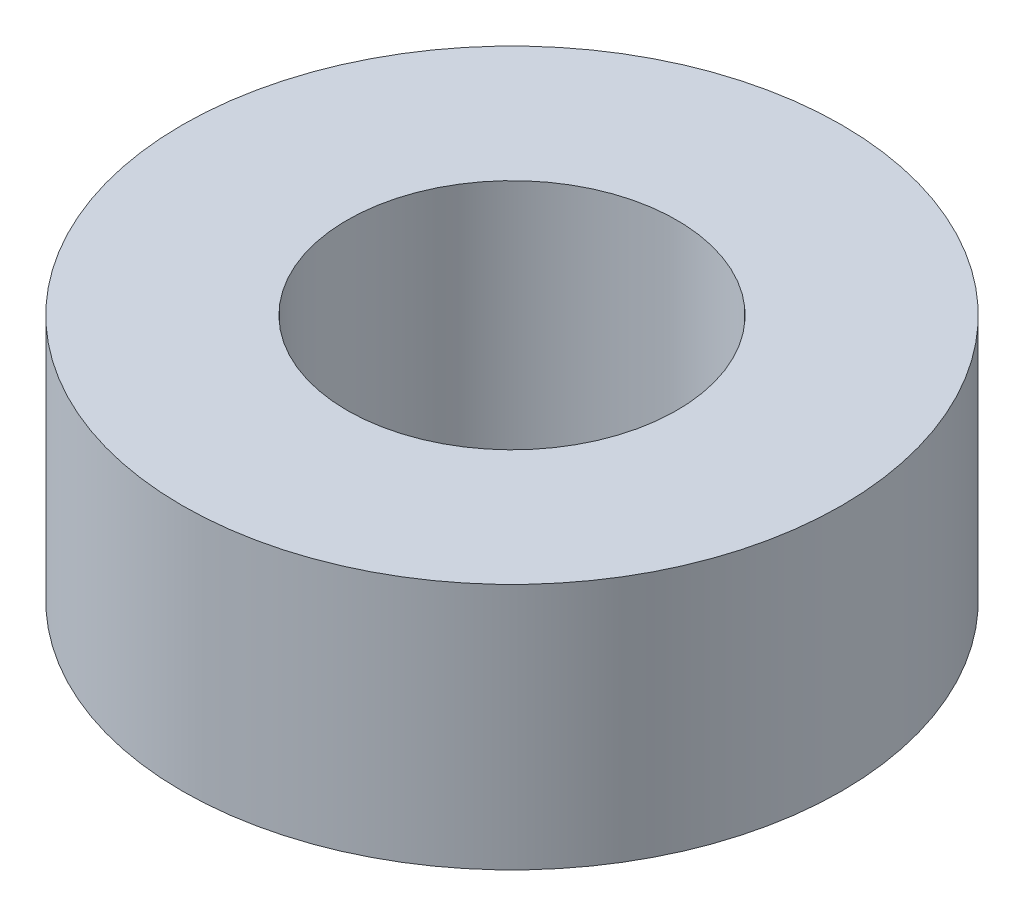
ISO-10303-21;
HEADER;
FILE_DESCRIPTION(('STEP AP214'),'2;1');
FILE_NAME('part.step','',(''),(''),'','','');
FILE_SCHEMA(('AUTOMOTIVE_DESIGN { 1 0 10303 214 1 1 1 1 }'));
ENDSEC;
DATA;
#1=APPLICATION_CONTEXT('core data for automotive mechanical design processes');
#2=APPLICATION_PROTOCOL_DEFINITION('international standard','automotive_design',2000,#1);
#3=PRODUCT_CONTEXT('',#1,'mechanical');
#4=PRODUCT('Part','Part','',(#3));
#5=PRODUCT_RELATED_PRODUCT_CATEGORY('part','',(#4));
#6=PRODUCT_DEFINITION_FORMATION('','',#4);
#7=PRODUCT_DEFINITION_CONTEXT('part definition',#1,'design');
#8=PRODUCT_DEFINITION('design','',#6,#7);
#9=PRODUCT_DEFINITION_SHAPE('','',#8);
#10=(LENGTH_UNIT() NAMED_UNIT(*) SI_UNIT(.MILLI.,.METRE.));
#11=(NAMED_UNIT(*) PLANE_ANGLE_UNIT() SI_UNIT($,.RADIAN.));
#12=(NAMED_UNIT(*) SI_UNIT($,.STERADIAN.) SOLID_ANGLE_UNIT());
#13=UNCERTAINTY_MEASURE_WITH_UNIT(LENGTH_MEASURE(1.E-05),#10,'distance_accuracy_value','');
#14=(GEOMETRIC_REPRESENTATION_CONTEXT(3) GLOBAL_UNCERTAINTY_ASSIGNED_CONTEXT((#13)) GLOBAL_UNIT_ASSIGNED_CONTEXT((#10,
#11,#12)) REPRESENTATION_CONTEXT('',''));
#15=CARTESIAN_POINT('',(0.,0.,0.));
#16=DIRECTION('',(0.,0.,1.));
#17=DIRECTION('',(1.,0.,0.));
#18=AXIS2_PLACEMENT_3D('',#15,#16,#17);
#19=CARTESIAN_POINT('',(0.,-1.5,0.));
#20=DIRECTION('',(0.,1.,0.));
#21=DIRECTION('',(0.,0.,1.));
#22=AXIS2_PLACEMENT_3D('',#19,#20,#21);
#23=CYLINDRICAL_SURFACE('',#22,4.);
#24=CARTESIAN_POINT('',(0.,-1.5,0.));
#25=DIRECTION('',(0.,1.,0.));
#26=DIRECTION('',(0.,0.,1.));
#27=AXIS2_PLACEMENT_3D('',#24,#25,#26);
#28=CIRCLE('',#27,4.);
#29=CARTESIAN_POINT('',(0.,-1.5,4.));
#30=VERTEX_POINT('',#29);
#31=EDGE_CURVE('E10',#30,#30,#28,.T.);
#32=ORIENTED_EDGE('',*,*,#31,.T.);
#33=EDGE_LOOP('',(#32));
#34=FACE_BOUND('',#33,.T.);
#35=CARTESIAN_POINT('',(0.,1.5,0.));
#36=DIRECTION('',(0.,1.,0.));
#37=DIRECTION('',(0.,0.,1.));
#38=AXIS2_PLACEMENT_3D('',#35,#36,#37);
#39=CIRCLE('',#38,4.);
#40=CARTESIAN_POINT('',(0.,1.5,4.));
#41=VERTEX_POINT('',#40);
#42=EDGE_CURVE('E48',#41,#41,#39,.T.);
#43=ORIENTED_EDGE('',*,*,#42,.F.);
#44=EDGE_LOOP('',(#43));
#45=FACE_BOUND('',#44,.T.);
#46=ADVANCED_FACE('F35',(#34,#45),#23,.T.);
#47=CARTESIAN_POINT('',(0.,-1.5,0.));
#48=DIRECTION('',(0.,1.,0.));
#49=DIRECTION('',(0.,0.,1.));
#50=AXIS2_PLACEMENT_3D('',#47,#48,#49);
#51=PLANE('',#50);
#52=CARTESIAN_POINT('',(0.,-1.5,0.));
#53=DIRECTION('',(0.,1.,0.));
#54=DIRECTION('',(0.,0.,1.));
#55=AXIS2_PLACEMENT_3D('',#52,#53,#54);
#56=CIRCLE('',#55,2.);
#57=CARTESIAN_POINT('',(0.,-1.5,2.));
#58=VERTEX_POINT('',#57);
#59=EDGE_CURVE('E42',#58,#58,#56,.T.);
#60=ORIENTED_EDGE('',*,*,#59,.T.);
#61=EDGE_LOOP('',(#60));
#62=FACE_BOUND('',#61,.T.);
#63=ORIENTED_EDGE('',*,*,#31,.F.);
#64=EDGE_LOOP('',(#63));
#65=FACE_BOUND('',#64,.T.);
#66=ADVANCED_FACE('F68',(#62,#65),#51,.F.);
#67=CARTESIAN_POINT('',(0.,-1.5,0.));
#68=DIRECTION('',(0.,1.,0.));
#69=DIRECTION('',(0.,0.,1.));
#70=AXIS2_PLACEMENT_3D('',#67,#68,#69);
#71=CYLINDRICAL_SURFACE('',#70,2.);
#72=ORIENTED_EDGE('',*,*,#59,.F.);
#73=EDGE_LOOP('',(#72));
#74=FACE_BOUND('',#73,.T.);
#75=CARTESIAN_POINT('',(0.,1.5,0.));
#76=DIRECTION('',(0.,1.,0.));
#77=DIRECTION('',(0.,0.,1.));
#78=AXIS2_PLACEMENT_3D('',#75,#76,#77);
#79=CIRCLE('',#78,2.);
#80=CARTESIAN_POINT('',(0.,1.5,2.));
#81=VERTEX_POINT('',#80);
#82=EDGE_CURVE('E53',#81,#81,#79,.T.);
#83=ORIENTED_EDGE('',*,*,#82,.T.);
#84=EDGE_LOOP('',(#83));
#85=FACE_BOUND('',#84,.T.);
#86=ADVANCED_FACE('F59',(#74,#85),#71,.F.);
#87=CARTESIAN_POINT('',(0.,1.5,0.));
#88=DIRECTION('',(0.,1.,0.));
#89=DIRECTION('',(0.,0.,1.));
#90=AXIS2_PLACEMENT_3D('',#87,#88,#89);
#91=PLANE('',#90);
#92=ORIENTED_EDGE('',*,*,#42,.T.);
#93=EDGE_LOOP('',(#92));
#94=FACE_BOUND('',#93,.T.);
#95=ORIENTED_EDGE('',*,*,#82,.F.);
#96=EDGE_LOOP('',(#95));
#97=FACE_BOUND('',#96,.T.);
#98=ADVANCED_FACE('F61',(#94,#97),#91,.T.);
#99=CLOSED_SHELL('',(#46,#66,#86,#98));
#100=MANIFOLD_SOLID_BREP('B2',#99);
#101=ADVANCED_BREP_SHAPE_REPRESENTATION('',(#18,#100),#14);
#102=SHAPE_DEFINITION_REPRESENTATION(#9,#101);
ENDSEC;
END-ISO-10303-21;
